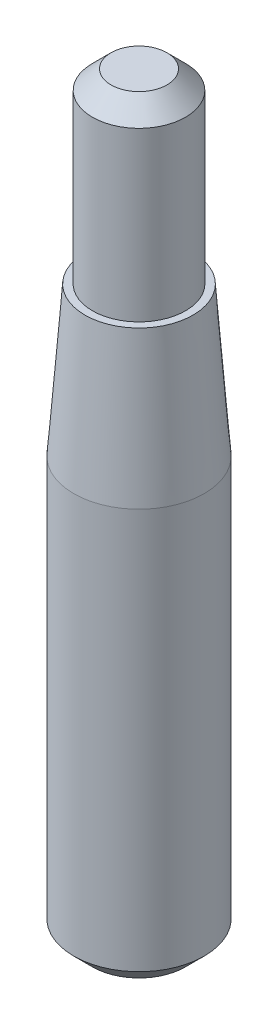
ISO-10303-21;
HEADER;
FILE_DESCRIPTION(('STEP AP214'),'2;1');
FILE_NAME('part.step','',(''),(''),'','','');
FILE_SCHEMA(('AUTOMOTIVE_DESIGN { 1 0 10303 214 1 1 1 1 }'));
ENDSEC;
DATA;
#1=APPLICATION_CONTEXT('core data for automotive mechanical design processes');
#2=APPLICATION_PROTOCOL_DEFINITION('international standard','automotive_design',2000,#1);
#3=PRODUCT_CONTEXT('',#1,'mechanical');
#4=PRODUCT('Part','Part','',(#3));
#5=PRODUCT_RELATED_PRODUCT_CATEGORY('part','',(#4));
#6=PRODUCT_DEFINITION_FORMATION('','',#4);
#7=PRODUCT_DEFINITION_CONTEXT('part definition',#1,'design');
#8=PRODUCT_DEFINITION('design','',#6,#7);
#9=PRODUCT_DEFINITION_SHAPE('','',#8);
#10=(LENGTH_UNIT() NAMED_UNIT(*) SI_UNIT(.MILLI.,.METRE.));
#11=(NAMED_UNIT(*) PLANE_ANGLE_UNIT() SI_UNIT($,.RADIAN.));
#12=(NAMED_UNIT(*) SI_UNIT($,.STERADIAN.) SOLID_ANGLE_UNIT());
#13=UNCERTAINTY_MEASURE_WITH_UNIT(LENGTH_MEASURE(1.E-05),#10,'distance_accuracy_value','');
#14=(GEOMETRIC_REPRESENTATION_CONTEXT(3) GLOBAL_UNCERTAINTY_ASSIGNED_CONTEXT((#13)) GLOBAL_UNIT_ASSIGNED_CONTEXT((#10,
#11,#12)) REPRESENTATION_CONTEXT('',''));
#15=CARTESIAN_POINT('',(0.,0.,0.));
#16=DIRECTION('',(0.,0.,1.));
#17=DIRECTION('',(1.,0.,0.));
#18=AXIS2_PLACEMENT_3D('',#15,#16,#17);
#19=CARTESIAN_POINT('',(0.,45.,0.));
#20=DIRECTION('',(0.,-1.,0.));
#21=DIRECTION('',(0.,0.,-1.));
#22=AXIS2_PLACEMENT_3D('',#19,#20,#21);
#23=CYLINDRICAL_SURFACE('',#22,7.);
#24=CARTESIAN_POINT('',(0.,2.00000000000004,0.));
#25=DIRECTION('',(0.,1.,0.));
#26=DIRECTION('',(0.,0.,1.));
#27=AXIS2_PLACEMENT_3D('',#24,#25,#26);
#28=CIRCLE('',#27,7.);
#29=CARTESIAN_POINT('',(0.,2.00000000000004,-7.));
#30=VERTEX_POINT('',#29);
#31=EDGE_CURVE('E63',#30,#30,#28,.T.);
#32=CARTESIAN_POINT('',(0.,45.,0.));
#33=DIRECTION('',(0.,1.,0.));
#34=DIRECTION('',(0.,0.,1.));
#35=AXIS2_PLACEMENT_3D('',#32,#33,#34);
#36=CIRCLE('',#35,7.);
#37=CARTESIAN_POINT('',(0.,45.,-7.));
#38=VERTEX_POINT('',#37);
#39=EDGE_CURVE('E68',#38,#38,#36,.T.);
#40=CARTESIAN_POINT('',(0.,2.00000000000004,-7.));
#41=CARTESIAN_POINT('',(0.,2.4479166666667,-7.));
#42=CARTESIAN_POINT('',(0.,2.89583333333337,-7.));
#43=CARTESIAN_POINT('',(0.,3.7916666666667,-7.));
#44=CARTESIAN_POINT('',(0.,4.23958333333337,-7.));
#45=CARTESIAN_POINT('',(0.,5.1354166666667,-7.));
#46=CARTESIAN_POINT('',(0.,5.58333333333337,-7.));
#47=CARTESIAN_POINT('',(0.,6.4791666666667,-7.));
#48=CARTESIAN_POINT('',(0.,6.92708333333337,-7.));
#49=CARTESIAN_POINT('',(0.,7.8229166666667,-7.));
#50=CARTESIAN_POINT('',(0.,8.27083333333337,-7.));
#51=CARTESIAN_POINT('',(0.,9.1666666666667,-7.));
#52=CARTESIAN_POINT('',(0.,9.61458333333336,-7.));
#53=CARTESIAN_POINT('',(0.,10.5104166666667,-7.));
#54=CARTESIAN_POINT('',(0.,10.9583333333334,-7.));
#55=CARTESIAN_POINT('',(0.,11.8541666666667,-7.));
#56=CARTESIAN_POINT('',(0.,12.3020833333334,-7.));
#57=CARTESIAN_POINT('',(0.,13.1979166666667,-7.));
#58=CARTESIAN_POINT('',(0.,13.6458333333334,-7.));
#59=CARTESIAN_POINT('',(0.,14.5416666666667,-7.));
#60=CARTESIAN_POINT('',(0.,14.9895833333334,-7.));
#61=CARTESIAN_POINT('',(0.,15.8854166666667,-7.));
#62=CARTESIAN_POINT('',(0.,16.3333333333334,-7.));
#63=CARTESIAN_POINT('',(0.,17.2291666666667,-7.));
#64=CARTESIAN_POINT('',(0.,17.6770833333334,-7.));
#65=CARTESIAN_POINT('',(0.,18.5729166666667,-7.));
#66=CARTESIAN_POINT('',(0.,19.0208333333334,-7.));
#67=CARTESIAN_POINT('',(0.,19.9166666666667,-7.));
#68=CARTESIAN_POINT('',(0.,20.3645833333334,-7.));
#69=CARTESIAN_POINT('',(0.,21.2604166666667,-7.));
#70=CARTESIAN_POINT('',(0.,21.7083333333334,-7.));
#71=CARTESIAN_POINT('',(0.,22.6041666666667,-7.));
#72=CARTESIAN_POINT('',(0.,23.0520833333333,-7.));
#73=CARTESIAN_POINT('',(0.,23.9479166666667,-7.));
#74=CARTESIAN_POINT('',(0.,24.3958333333333,-7.));
#75=CARTESIAN_POINT('',(0.,25.2916666666667,-7.));
#76=CARTESIAN_POINT('',(0.,25.7395833333333,-7.));
#77=CARTESIAN_POINT('',(0.,26.6354166666667,-7.));
#78=CARTESIAN_POINT('',(0.,27.0833333333333,-7.));
#79=CARTESIAN_POINT('',(0.,27.9791666666667,-7.));
#80=CARTESIAN_POINT('',(0.,28.4270833333333,-7.));
#81=CARTESIAN_POINT('',(0.,29.3229166666667,-7.));
#82=CARTESIAN_POINT('',(0.,29.7708333333333,-7.));
#83=CARTESIAN_POINT('',(0.,30.6666666666667,-7.));
#84=CARTESIAN_POINT('',(0.,31.1145833333333,-7.));
#85=CARTESIAN_POINT('',(0.,32.0104166666667,-7.));
#86=CARTESIAN_POINT('',(0.,32.4583333333333,-7.));
#87=CARTESIAN_POINT('',(0.,33.3541666666667,-7.));
#88=CARTESIAN_POINT('',(0.,33.8020833333333,-7.));
#89=CARTESIAN_POINT('',(0.,34.6979166666667,-7.));
#90=CARTESIAN_POINT('',(0.,35.1458333333333,-7.));
#91=CARTESIAN_POINT('',(0.,36.0416666666667,-7.));
#92=CARTESIAN_POINT('',(0.,36.4895833333333,-7.));
#93=CARTESIAN_POINT('',(0.,37.3854166666667,-7.));
#94=CARTESIAN_POINT('',(0.,37.8333333333333,-7.));
#95=CARTESIAN_POINT('',(0.,38.7291666666667,-7.));
#96=CARTESIAN_POINT('',(0.,39.1770833333333,-7.));
#97=CARTESIAN_POINT('',(0.,40.0729166666667,-7.));
#98=CARTESIAN_POINT('',(0.,40.5208333333333,-7.));
#99=CARTESIAN_POINT('',(0.,41.4166666666667,-7.));
#100=CARTESIAN_POINT('',(0.,41.8645833333333,-7.));
#101=CARTESIAN_POINT('',(0.,42.7604166666667,-7.));
#102=CARTESIAN_POINT('',(0.,43.2083333333333,-7.));
#103=CARTESIAN_POINT('',(0.,44.1041666666667,-7.));
#104=CARTESIAN_POINT('',(0.,44.5520833333333,-7.));
#105=CARTESIAN_POINT('',(0.,45.,-7.));
#106=B_SPLINE_CURVE_WITH_KNOTS('',3,(#40,#41,#42,#43,#44,#45,#46,#47,#48,#49,#50,#51,#52,#53,
#54,#55,#56,#57,#58,#59,#60,#61,#62,#63,#64,#65,#66,#67,#68,#69,#70,#71,#72,#73,#74,#75,#76,#77,
#78,#79,#80,#81,#82,#83,#84,#85,#86,#87,#88,#89,#90,#91,#92,#93,#94,#95,#96,#97,#98,#99,#100,
#101,#102,#103,#104,#105),.UNSPECIFIED.,.F.,.F.,(4,2,2,2,2,2,2,2,2,2,2,2,2,2,2,2,2,2,2,2,2,2,2,
2,2,2,2,2,2,2,2,2,4),(0.,1.34375,2.6875,4.03125,5.375,6.71875,8.06249999999999,9.40624999999999,
10.75,12.09375,13.4375,14.78125,16.125,17.46875,18.8125,20.15625,21.5,22.84375,24.1875,25.53125,
26.875,28.21875,29.5625,30.90625,32.25,33.59375,34.9375,36.28125,37.625,38.96875,40.3125,
41.65625,43.),.UNSPECIFIED.);
#107=EDGE_CURVE('BSEAM48',#30,#38,#106,.T.);
#108=ORIENTED_EDGE('',*,*,#31,.T.);
#109=ORIENTED_EDGE('',*,*,#39,.F.);
#110=ORIENTED_EDGE('',*,*,#107,.T.);
#111=ORIENTED_EDGE('',*,*,#107,.F.);
#112=EDGE_LOOP('',(#108,#110,#109,#111));
#113=FACE_BOUND('',#112,.T.);
#114=ADVANCED_FACE('F48',(#113),#23,.T.);
#115=CARTESIAN_POINT('',(0.,0.,0.));
#116=DIRECTION('',(0.,1.,0.));
#117=DIRECTION('',(0.,0.,1.));
#118=AXIS2_PLACEMENT_3D('',#115,#116,#117);
#119=PLANE('',#118);
#120=CARTESIAN_POINT('',(0.,0.,0.));
#121=DIRECTION('',(0.,1.,0.));
#122=DIRECTION('',(0.,0.,1.));
#123=AXIS2_PLACEMENT_3D('',#120,#121,#122);
#124=CIRCLE('',#123,4.99999999999995);
#125=CARTESIAN_POINT('',(0.,0.,4.99999999999995));
#126=VERTEX_POINT('',#125);
#127=EDGE_CURVE('E59',#126,#126,#124,.F.);
#128=ORIENTED_EDGE('',*,*,#127,.T.);
#129=EDGE_LOOP('',(#128));
#130=FACE_BOUND('',#129,.T.);
#131=ADVANCED_FACE('F89',(#130),#119,.F.);
#132=CARTESIAN_POINT('',(0.,45.,0.));
#133=DIRECTION('',(0.,-1.,0.));
#134=DIRECTION('',(0.,0.,1.));
#135=AXIS2_PLACEMENT_3D('',#132,#133,#134);
#136=CONICAL_SURFACE('',#135,7.,0.074857171618037);
#137=CARTESIAN_POINT('',(0.,61.,0.));
#138=DIRECTION('',(0.,1.,0.));
#139=DIRECTION('',(0.,0.,1.));
#140=AXIS2_PLACEMENT_3D('',#137,#138,#139);
#141=CIRCLE('',#140,5.80004305832338);
#142=CARTESIAN_POINT('',(0.,61.,5.80004305832338));
#143=VERTEX_POINT('',#142);
#144=EDGE_CURVE('E71',#143,#143,#141,.T.);
#145=ORIENTED_EDGE('',*,*,#144,.F.);
#146=EDGE_LOOP('',(#145));
#147=FACE_BOUND('',#146,.T.);
#148=ORIENTED_EDGE('',*,*,#39,.T.);
#149=EDGE_LOOP('',(#148));
#150=FACE_BOUND('',#149,.T.);
#151=ADVANCED_FACE('F83',(#147,#150),#136,.T.);
#152=CARTESIAN_POINT('',(0.,61.,0.));
#153=DIRECTION('',(0.,1.,0.));
#154=DIRECTION('',(0.,0.,1.));
#155=AXIS2_PLACEMENT_3D('',#152,#153,#154);
#156=PLANE('',#155);
#157=CARTESIAN_POINT('',(0.,61.,0.));
#158=DIRECTION('',(0.,1.,0.));
#159=DIRECTION('',(0.,0.,1.));
#160=AXIS2_PLACEMENT_3D('',#157,#158,#159);
#161=CIRCLE('',#160,5.);
#162=CARTESIAN_POINT('',(0.,61.,5.));
#163=VERTEX_POINT('',#162);
#164=EDGE_CURVE('E74',#163,#163,#161,.T.);
#165=ORIENTED_EDGE('',*,*,#164,.F.);
#166=EDGE_LOOP('',(#165));
#167=FACE_BOUND('',#166,.T.);
#168=ORIENTED_EDGE('',*,*,#144,.T.);
#169=EDGE_LOOP('',(#168));
#170=FACE_BOUND('',#169,.T.);
#171=ADVANCED_FACE('F80',(#167,#170),#156,.T.);
#172=CARTESIAN_POINT('',(0.,81.,0.));
#173=DIRECTION('',(0.,-1.,0.));
#174=DIRECTION('',(0.,0.,-1.));
#175=AXIS2_PLACEMENT_3D('',#172,#173,#174);
#176=CYLINDRICAL_SURFACE('',#175,5.);
#177=CARTESIAN_POINT('',(0.,79.,0.));
#178=DIRECTION('',(0.,1.,0.));
#179=DIRECTION('',(0.,0.,1.));
#180=AXIS2_PLACEMENT_3D('',#177,#178,#179);
#181=CIRCLE('',#180,5.);
#182=CARTESIAN_POINT('',(0.,79.,5.));
#183=VERTEX_POINT('',#182);
#184=EDGE_CURVE('E12',#183,#183,#181,.F.);
#185=ORIENTED_EDGE('',*,*,#184,.T.);
#186=EDGE_LOOP('',(#185));
#187=FACE_BOUND('',#186,.T.);
#188=ORIENTED_EDGE('',*,*,#164,.T.);
#189=EDGE_LOOP('',(#188));
#190=FACE_BOUND('',#189,.T.);
#191=ADVANCED_FACE('F78',(#187,#190),#176,.T.);
#192=CARTESIAN_POINT('',(0.,81.,0.));
#193=DIRECTION('',(0.,1.,0.));
#194=DIRECTION('',(0.,0.,1.));
#195=AXIS2_PLACEMENT_3D('',#192,#193,#194);
#196=PLANE('',#195);
#197=CARTESIAN_POINT('',(0.,81.,0.));
#198=DIRECTION('',(0.,1.,0.));
#199=DIRECTION('',(0.,0.,1.));
#200=AXIS2_PLACEMENT_3D('',#197,#198,#199);
#201=CIRCLE('',#200,3.00000000000002);
#202=CARTESIAN_POINT('',(0.,81.,3.00000000000002));
#203=VERTEX_POINT('',#202);
#204=EDGE_CURVE('E55',#203,#203,#201,.T.);
#205=ORIENTED_EDGE('',*,*,#204,.T.);
#206=EDGE_LOOP('',(#205));
#207=FACE_BOUND('',#206,.T.);
#208=ADVANCED_FACE('F103',(#207),#196,.T.);
#209=CARTESIAN_POINT('',(0.,2.00000000000004,0.));
#210=DIRECTION('',(0.,1.,0.));
#211=DIRECTION('',(0.,0.,1.));
#212=AXIS2_PLACEMENT_3D('',#209,#210,#211);
#213=CONICAL_SURFACE('',#212,7.,0.78539816339745);
#214=ORIENTED_EDGE('',*,*,#127,.F.);
#215=EDGE_LOOP('',(#214));
#216=FACE_BOUND('',#215,.T.);
#217=ORIENTED_EDGE('',*,*,#31,.F.);
#218=EDGE_LOOP('',(#217));
#219=FACE_BOUND('',#218,.T.);
#220=ADVANCED_FACE('F101',(#216,#219),#213,.T.);
#221=CARTESIAN_POINT('',(0.,81.,0.));
#222=DIRECTION('',(0.,-1.,0.));
#223=DIRECTION('',(0.,0.,-1.));
#224=AXIS2_PLACEMENT_3D('',#221,#222,#223);
#225=CONICAL_SURFACE('',#224,3.00000000000002,0.785398163397447);
#226=ORIENTED_EDGE('',*,*,#184,.F.);
#227=EDGE_LOOP('',(#226));
#228=FACE_BOUND('',#227,.T.);
#229=ORIENTED_EDGE('',*,*,#204,.F.);
#230=EDGE_LOOP('',(#229));
#231=FACE_BOUND('',#230,.T.);
#232=ADVANCED_FACE('F50',(#228,#231),#225,.T.);
#233=CLOSED_SHELL('',(#114,#131,#151,#171,#191,#208,#220,#232));
#234=MANIFOLD_SOLID_BREP('B2',#233);
#235=ADVANCED_BREP_SHAPE_REPRESENTATION('',(#18,#234),#14);
#236=SHAPE_DEFINITION_REPRESENTATION(#9,#235);
ENDSEC;
END-ISO-10303-21;
